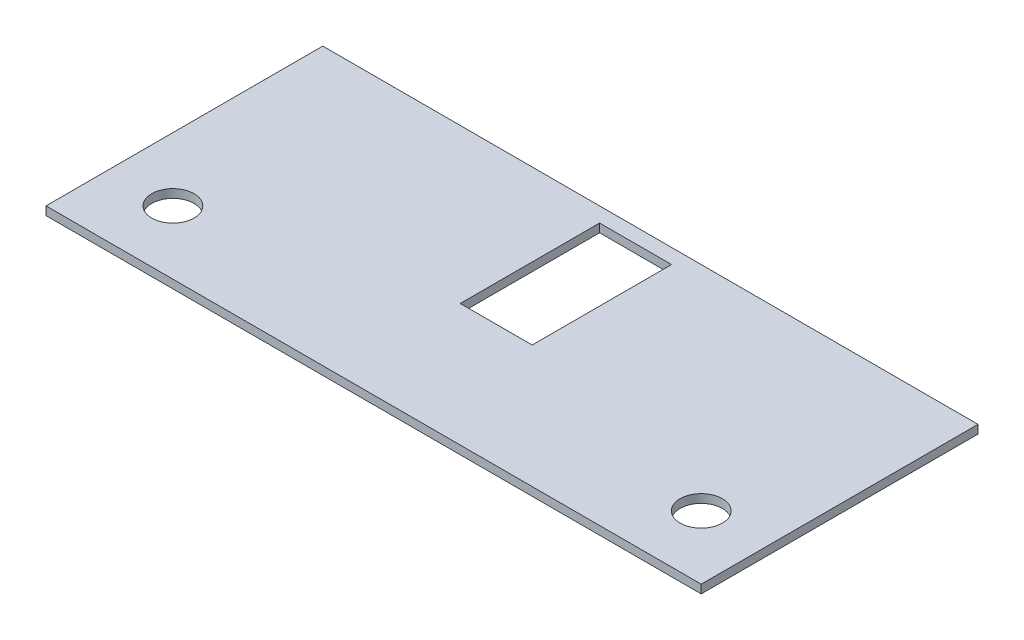
ISO-10303-21;
HEADER;
FILE_DESCRIPTION(('STEP AP214'),'2;1');
FILE_NAME('part.step','',(''),(''),'','','');
FILE_SCHEMA(('AUTOMOTIVE_DESIGN { 1 0 10303 214 1 1 1 1 }'));
ENDSEC;
DATA;
#1=APPLICATION_CONTEXT('core data for automotive mechanical design processes');
#2=APPLICATION_PROTOCOL_DEFINITION('international standard','automotive_design',2000,#1);
#3=PRODUCT_CONTEXT('',#1,'mechanical');
#4=PRODUCT('Part','Part','',(#3));
#5=PRODUCT_RELATED_PRODUCT_CATEGORY('part','',(#4));
#6=PRODUCT_DEFINITION_FORMATION('','',#4);
#7=PRODUCT_DEFINITION_CONTEXT('part definition',#1,'design');
#8=PRODUCT_DEFINITION('design','',#6,#7);
#9=PRODUCT_DEFINITION_SHAPE('','',#8);
#10=(LENGTH_UNIT() NAMED_UNIT(*) SI_UNIT(.MILLI.,.METRE.));
#11=(NAMED_UNIT(*) PLANE_ANGLE_UNIT() SI_UNIT($,.RADIAN.));
#12=(NAMED_UNIT(*) SI_UNIT($,.STERADIAN.) SOLID_ANGLE_UNIT());
#13=UNCERTAINTY_MEASURE_WITH_UNIT(LENGTH_MEASURE(1.E-05),#10,'distance_accuracy_value','');
#14=(GEOMETRIC_REPRESENTATION_CONTEXT(3) GLOBAL_UNCERTAINTY_ASSIGNED_CONTEXT((#13)) GLOBAL_UNIT_ASSIGNED_CONTEXT((#10,
#11,#12)) REPRESENTATION_CONTEXT('',''));
#15=CARTESIAN_POINT('',(0.,0.,0.));
#16=DIRECTION('',(0.,0.,1.));
#17=DIRECTION('',(1.,0.,0.));
#18=AXIS2_PLACEMENT_3D('',#15,#16,#17);
#19=CARTESIAN_POINT('',(77.4448618966642,2.,45.0351633886484));
#20=DIRECTION('',(0.,1.,0.));
#21=DIRECTION('',(0.,0.,1.));
#22=AXIS2_PLACEMENT_3D('',#19,#20,#21);
#23=PLANE('',#22);
#24=CARTESIAN_POINT('',(62.4448618966642,2.,30.0351633886483));
#25=DIRECTION('',(0.,1.,0.));
#26=DIRECTION('',(0.,0.,-1.));
#27=AXIS2_PLACEMENT_3D('',#24,#25,#26);
#28=CIRCLE('',#27,4.99999999999999);
#29=CARTESIAN_POINT('',(62.4448618966642,2.,25.0351633886483));
#30=VERTEX_POINT('',#29);
#31=EDGE_CURVE('E229',#30,#30,#28,.T.);
#32=ORIENTED_EDGE('',*,*,#31,.F.);
#33=EDGE_LOOP('',(#32));
#34=FACE_BOUND('',#33,.T.);
#35=CARTESIAN_POINT('',(-62.4448618966642,2.,30.0351633886484));
#36=DIRECTION('',(0.,1.,0.));
#37=DIRECTION('',(0.,0.,1.));
#38=AXIS2_PLACEMENT_3D('',#35,#36,#37);
#39=CIRCLE('',#38,5.);
#40=CARTESIAN_POINT('',(-62.4448618966642,2.,35.0351633886484));
#41=VERTEX_POINT('',#40);
#42=EDGE_CURVE('E231',#41,#41,#39,.T.);
#43=ORIENTED_EDGE('',*,*,#42,.F.);
#44=EDGE_LOOP('',(#43));
#45=FACE_BOUND('',#44,.T.);
#46=DIRECTION('',(0.,0.,-1.));
#47=VECTOR('',#46,1.);
#48=CARTESIAN_POINT('',(77.4448618966642,2.,-20.396112225157));
#49=LINE('',#48,#47);
#50=CARTESIAN_POINT('',(77.4448618966642,2.,45.0351633886484));
#51=VERTEX_POINT('',#50);
#52=CARTESIAN_POINT('',(77.4448618966642,2.,-20.396112225157));
#53=VERTEX_POINT('',#52);
#54=EDGE_CURVE('E135',#51,#53,#49,.T.);
#55=ORIENTED_EDGE('',*,*,#54,.T.);
#56=DIRECTION('',(-1.,0.,0.));
#57=VECTOR('',#56,1.);
#58=CARTESIAN_POINT('',(-77.4448618966642,2.,-20.396112225157));
#59=LINE('',#58,#57);
#60=CARTESIAN_POINT('',(-77.4448618966642,2.,-20.396112225157));
#61=VERTEX_POINT('',#60);
#62=EDGE_CURVE('E138',#53,#61,#59,.T.);
#63=ORIENTED_EDGE('',*,*,#62,.T.);
#64=DIRECTION('',(0.,0.,1.));
#65=VECTOR('',#64,1.);
#66=CARTESIAN_POINT('',(-77.4448618966642,2.,-20.396112225157));
#67=LINE('',#66,#65);
#68=CARTESIAN_POINT('',(-77.4448618966642,2.,45.0351633886484));
#69=VERTEX_POINT('',#68);
#70=EDGE_CURVE('E141',#61,#69,#67,.T.);
#71=ORIENTED_EDGE('',*,*,#70,.T.);
#72=DIRECTION('',(1.,0.,0.));
#73=VECTOR('',#72,1.);
#74=CARTESIAN_POINT('',(-77.4448618966642,2.,45.0351633886484));
#75=LINE('',#74,#73);
#76=EDGE_CURVE('E143',#69,#51,#75,.T.);
#77=ORIENTED_EDGE('',*,*,#76,.T.);
#78=EDGE_LOOP('',(#55,#63,#71,#77));
#79=FACE_BOUND('',#78,.T.);
#80=DIRECTION('',(-1.,0.,0.));
#81=VECTOR('',#80,1.);
#82=CARTESIAN_POINT('',(-8.49999999999999,2.,-16.8877392133737));
#83=LINE('',#82,#81);
#84=CARTESIAN_POINT('',(8.50000000000001,2.,-16.8877392133737));
#85=VERTEX_POINT('',#84);
#86=CARTESIAN_POINT('',(-8.49999999999999,2.,-16.8877392133737));
#87=VERTEX_POINT('',#86);
#88=EDGE_CURVE('E105',#85,#87,#83,.T.);
#89=ORIENTED_EDGE('',*,*,#88,.F.);
#90=DIRECTION('',(0.,0.,-1.));
#91=VECTOR('',#90,1.);
#92=CARTESIAN_POINT('',(8.50000000000001,2.,-16.8877392133737));
#93=LINE('',#92,#91);
#94=CARTESIAN_POINT('',(8.50000000000001,2.,16.0531848706699));
#95=VERTEX_POINT('',#94);
#96=EDGE_CURVE('E97',#95,#85,#93,.T.);
#97=ORIENTED_EDGE('',*,*,#96,.F.);
#98=DIRECTION('',(1.,0.,0.));
#99=VECTOR('',#98,1.);
#100=CARTESIAN_POINT('',(-8.49999999999999,2.,16.0531848706699));
#101=LINE('',#100,#99);
#102=CARTESIAN_POINT('',(-8.49999999999999,2.,16.0531848706699));
#103=VERTEX_POINT('',#102);
#104=EDGE_CURVE('E119',#103,#95,#101,.T.);
#105=ORIENTED_EDGE('',*,*,#104,.F.);
#106=DIRECTION('',(0.,0.,1.));
#107=VECTOR('',#106,1.);
#108=CARTESIAN_POINT('',(-8.49999999999999,2.,-16.8877392133737));
#109=LINE('',#108,#107);
#110=EDGE_CURVE('E117',#87,#103,#109,.T.);
#111=ORIENTED_EDGE('',*,*,#110,.F.);
#112=EDGE_LOOP('',(#89,#97,#105,#111));
#113=FACE_BOUND('',#112,.T.);
#114=ADVANCED_FACE('F32',(#34,#45,#79,#113),#23,.T.);
#115=CARTESIAN_POINT('',(77.4448618966642,0.,45.0351633886484));
#116=DIRECTION('',(0.,1.,0.));
#117=DIRECTION('',(0.,0.,1.));
#118=AXIS2_PLACEMENT_3D('',#115,#116,#117);
#119=PLANE('',#118);
#120=CARTESIAN_POINT('',(62.4448618966642,0.,30.0351633886483));
#121=DIRECTION('',(0.,1.,0.));
#122=DIRECTION('',(0.,0.,-1.));
#123=AXIS2_PLACEMENT_3D('',#120,#121,#122);
#124=CIRCLE('',#123,4.99999999999999);
#125=CARTESIAN_POINT('',(62.4448618966642,0.,25.0351633886483));
#126=VERTEX_POINT('',#125);
#127=EDGE_CURVE('E227',#126,#126,#124,.T.);
#128=ORIENTED_EDGE('',*,*,#127,.T.);
#129=EDGE_LOOP('',(#128));
#130=FACE_BOUND('',#129,.T.);
#131=CARTESIAN_POINT('',(-62.4448618966642,0.,30.0351633886484));
#132=DIRECTION('',(0.,1.,0.));
#133=DIRECTION('',(0.,0.,1.));
#134=AXIS2_PLACEMENT_3D('',#131,#132,#133);
#135=CIRCLE('',#134,5.);
#136=CARTESIAN_POINT('',(-62.4448618966642,0.,35.0351633886484));
#137=VERTEX_POINT('',#136);
#138=EDGE_CURVE('E125',#137,#137,#135,.T.);
#139=ORIENTED_EDGE('',*,*,#138,.T.);
#140=EDGE_LOOP('',(#139));
#141=FACE_BOUND('',#140,.T.);
#142=DIRECTION('',(0.,0.,-1.));
#143=VECTOR('',#142,1.);
#144=CARTESIAN_POINT('',(77.4448618966642,0.,-20.396112225157));
#145=LINE('',#144,#143);
#146=CARTESIAN_POINT('',(77.4448618966642,0.,45.0351633886484));
#147=VERTEX_POINT('',#146);
#148=CARTESIAN_POINT('',(77.4448618966642,0.,-20.396112225157));
#149=VERTEX_POINT('',#148);
#150=EDGE_CURVE('E113',#147,#149,#145,.T.);
#151=ORIENTED_EDGE('',*,*,#150,.F.);
#152=DIRECTION('',(1.,0.,0.));
#153=VECTOR('',#152,1.);
#154=CARTESIAN_POINT('',(-77.4448618966642,0.,45.0351633886484));
#155=LINE('',#154,#153);
#156=CARTESIAN_POINT('',(-77.4448618966642,0.,45.0351633886484));
#157=VERTEX_POINT('',#156);
#158=EDGE_CURVE('E139',#157,#147,#155,.T.);
#159=ORIENTED_EDGE('',*,*,#158,.F.);
#160=DIRECTION('',(0.,0.,1.));
#161=VECTOR('',#160,1.);
#162=CARTESIAN_POINT('',(-77.4448618966642,0.,-20.396112225157));
#163=LINE('',#162,#161);
#164=CARTESIAN_POINT('',(-77.4448618966642,0.,-20.396112225157));
#165=VERTEX_POINT('',#164);
#166=EDGE_CURVE('E150',#165,#157,#163,.T.);
#167=ORIENTED_EDGE('',*,*,#166,.F.);
#168=DIRECTION('',(-1.,0.,0.));
#169=VECTOR('',#168,1.);
#170=CARTESIAN_POINT('',(-77.4448618966642,0.,-20.396112225157));
#171=LINE('',#170,#169);
#172=EDGE_CURVE('E148',#149,#165,#171,.T.);
#173=ORIENTED_EDGE('',*,*,#172,.F.);
#174=EDGE_LOOP('',(#151,#159,#167,#173));
#175=FACE_BOUND('',#174,.T.);
#176=DIRECTION('',(0.,0.,-1.));
#177=VECTOR('',#176,1.);
#178=CARTESIAN_POINT('',(8.50000000000001,0.,-16.8877392133737));
#179=LINE('',#178,#177);
#180=CARTESIAN_POINT('',(8.50000000000001,0.,16.0531848706699));
#181=VERTEX_POINT('',#180);
#182=CARTESIAN_POINT('',(8.50000000000001,0.,-16.8877392133737));
#183=VERTEX_POINT('',#182);
#184=EDGE_CURVE('E55',#181,#183,#179,.T.);
#185=ORIENTED_EDGE('',*,*,#184,.T.);
#186=DIRECTION('',(-1.,0.,0.));
#187=VECTOR('',#186,1.);
#188=CARTESIAN_POINT('',(-8.49999999999999,0.,-16.8877392133737));
#189=LINE('',#188,#187);
#190=CARTESIAN_POINT('',(-8.49999999999999,0.,-16.8877392133737));
#191=VERTEX_POINT('',#190);
#192=EDGE_CURVE('E112',#183,#191,#189,.T.);
#193=ORIENTED_EDGE('',*,*,#192,.T.);
#194=DIRECTION('',(0.,0.,1.));
#195=VECTOR('',#194,1.);
#196=CARTESIAN_POINT('',(-8.49999999999999,0.,-16.8877392133737));
#197=LINE('',#196,#195);
#198=CARTESIAN_POINT('',(-8.49999999999999,0.,16.0531848706699));
#199=VERTEX_POINT('',#198);
#200=EDGE_CURVE('E127',#191,#199,#197,.T.);
#201=ORIENTED_EDGE('',*,*,#200,.T.);
#202=DIRECTION('',(1.,0.,0.));
#203=VECTOR('',#202,1.);
#204=CARTESIAN_POINT('',(-8.49999999999999,0.,16.0531848706699));
#205=LINE('',#204,#203);
#206=EDGE_CURVE('E106',#199,#181,#205,.T.);
#207=ORIENTED_EDGE('',*,*,#206,.T.);
#208=EDGE_LOOP('',(#185,#193,#201,#207));
#209=FACE_BOUND('',#208,.T.);
#210=ADVANCED_FACE('F168',(#130,#141,#175,#209),#119,.F.);
#211=CARTESIAN_POINT('',(77.4448618966642,2.,-20.396112225157));
#212=DIRECTION('',(-1.,0.,0.));
#213=DIRECTION('',(0.,0.,1.));
#214=AXIS2_PLACEMENT_3D('',#211,#212,#213);
#215=PLANE('',#214);
#216=ORIENTED_EDGE('',*,*,#150,.T.);
#217=DIRECTION('',(0.,-1.,0.));
#218=VECTOR('',#217,1.);
#219=CARTESIAN_POINT('',(77.4448618966642,2.,-20.396112225157));
#220=LINE('',#219,#218);
#221=EDGE_CURVE('E11',#53,#149,#220,.T.);
#222=ORIENTED_EDGE('',*,*,#221,.F.);
#223=ORIENTED_EDGE('',*,*,#54,.F.);
#224=DIRECTION('',(0.,-1.,0.));
#225=VECTOR('',#224,1.);
#226=CARTESIAN_POINT('',(77.4448618966642,2.,45.0351633886484));
#227=LINE('',#226,#225);
#228=EDGE_CURVE('E145',#51,#147,#227,.T.);
#229=ORIENTED_EDGE('',*,*,#228,.T.);
#230=EDGE_LOOP('',(#216,#222,#223,#229));
#231=FACE_BOUND('',#230,.T.);
#232=ADVANCED_FACE('F34',(#231),#215,.F.);
#233=CARTESIAN_POINT('',(-77.4448618966642,2.,-20.396112225157));
#234=DIRECTION('',(0.,0.,1.));
#235=DIRECTION('',(1.,0.,0.));
#236=AXIS2_PLACEMENT_3D('',#233,#234,#235);
#237=PLANE('',#236);
#238=ORIENTED_EDGE('',*,*,#172,.T.);
#239=DIRECTION('',(0.,-1.,0.));
#240=VECTOR('',#239,1.);
#241=CARTESIAN_POINT('',(-77.4448618966642,2.,-20.396112225157));
#242=LINE('',#241,#240);
#243=EDGE_CURVE('E40',#61,#165,#242,.T.);
#244=ORIENTED_EDGE('',*,*,#243,.F.);
#245=ORIENTED_EDGE('',*,*,#62,.F.);
#246=ORIENTED_EDGE('',*,*,#221,.T.);
#247=EDGE_LOOP('',(#238,#244,#245,#246));
#248=FACE_BOUND('',#247,.T.);
#249=ADVANCED_FACE('F178',(#248),#237,.F.);
#250=CARTESIAN_POINT('',(-77.4448618966642,2.,-20.396112225157));
#251=DIRECTION('',(1.,0.,0.));
#252=DIRECTION('',(0.,0.,-1.));
#253=AXIS2_PLACEMENT_3D('',#250,#251,#252);
#254=PLANE('',#253);
#255=ORIENTED_EDGE('',*,*,#166,.T.);
#256=DIRECTION('',(0.,-1.,0.));
#257=VECTOR('',#256,1.);
#258=CARTESIAN_POINT('',(-77.4448618966642,2.,45.0351633886484));
#259=LINE('',#258,#257);
#260=EDGE_CURVE('E155',#69,#157,#259,.T.);
#261=ORIENTED_EDGE('',*,*,#260,.F.);
#262=ORIENTED_EDGE('',*,*,#70,.F.);
#263=ORIENTED_EDGE('',*,*,#243,.T.);
#264=EDGE_LOOP('',(#255,#261,#262,#263));
#265=FACE_BOUND('',#264,.T.);
#266=ADVANCED_FACE('F162',(#265),#254,.F.);
#267=CARTESIAN_POINT('',(-77.4448618966642,2.,45.0351633886484));
#268=DIRECTION('',(0.,0.,-1.));
#269=DIRECTION('',(-1.,0.,0.));
#270=AXIS2_PLACEMENT_3D('',#267,#268,#269);
#271=PLANE('',#270);
#272=ORIENTED_EDGE('',*,*,#158,.T.);
#273=ORIENTED_EDGE('',*,*,#228,.F.);
#274=ORIENTED_EDGE('',*,*,#76,.F.);
#275=ORIENTED_EDGE('',*,*,#260,.T.);
#276=EDGE_LOOP('',(#272,#273,#274,#275));
#277=FACE_BOUND('',#276,.T.);
#278=ADVANCED_FACE('F172',(#277),#271,.F.);
#279=CARTESIAN_POINT('',(8.50000000000001,2.,-16.8877392133737));
#280=DIRECTION('',(-1.,0.,0.));
#281=DIRECTION('',(0.,0.,1.));
#282=AXIS2_PLACEMENT_3D('',#279,#280,#281);
#283=PLANE('',#282);
#284=ORIENTED_EDGE('',*,*,#184,.F.);
#285=DIRECTION('',(0.,-1.,0.));
#286=VECTOR('',#285,1.);
#287=CARTESIAN_POINT('',(8.50000000000001,2.,16.0531848706699));
#288=LINE('',#287,#286);
#289=EDGE_CURVE('E101',#95,#181,#288,.T.);
#290=ORIENTED_EDGE('',*,*,#289,.F.);
#291=ORIENTED_EDGE('',*,*,#96,.T.);
#292=DIRECTION('',(0.,-1.,0.));
#293=VECTOR('',#292,1.);
#294=CARTESIAN_POINT('',(8.50000000000001,2.,-16.8877392133737));
#295=LINE('',#294,#293);
#296=EDGE_CURVE('E100',#85,#183,#295,.T.);
#297=ORIENTED_EDGE('',*,*,#296,.T.);
#298=EDGE_LOOP('',(#284,#290,#291,#297));
#299=FACE_BOUND('',#298,.T.);
#300=ADVANCED_FACE('F99',(#299),#283,.T.);
#301=CARTESIAN_POINT('',(-8.49999999999999,2.,-16.8877392133737));
#302=DIRECTION('',(0.,0.,1.));
#303=DIRECTION('',(1.,0.,0.));
#304=AXIS2_PLACEMENT_3D('',#301,#302,#303);
#305=PLANE('',#304);
#306=ORIENTED_EDGE('',*,*,#192,.F.);
#307=ORIENTED_EDGE('',*,*,#296,.F.);
#308=ORIENTED_EDGE('',*,*,#88,.T.);
#309=DIRECTION('',(0.,-1.,0.));
#310=VECTOR('',#309,1.);
#311=CARTESIAN_POINT('',(-8.49999999999999,2.,-16.8877392133737));
#312=LINE('',#311,#310);
#313=EDGE_CURVE('E114',#87,#191,#312,.T.);
#314=ORIENTED_EDGE('',*,*,#313,.T.);
#315=EDGE_LOOP('',(#306,#307,#308,#314));
#316=FACE_BOUND('',#315,.T.);
#317=ADVANCED_FACE('F109',(#316),#305,.T.);
#318=CARTESIAN_POINT('',(-8.49999999999999,2.,-16.8877392133737));
#319=DIRECTION('',(1.,0.,0.));
#320=DIRECTION('',(0.,0.,-1.));
#321=AXIS2_PLACEMENT_3D('',#318,#319,#320);
#322=PLANE('',#321);
#323=ORIENTED_EDGE('',*,*,#200,.F.);
#324=ORIENTED_EDGE('',*,*,#313,.F.);
#325=ORIENTED_EDGE('',*,*,#110,.T.);
#326=DIRECTION('',(0.,-1.,0.));
#327=VECTOR('',#326,1.);
#328=CARTESIAN_POINT('',(-8.49999999999999,2.,16.0531848706699));
#329=LINE('',#328,#327);
#330=EDGE_CURVE('E47',#103,#199,#329,.T.);
#331=ORIENTED_EDGE('',*,*,#330,.T.);
#332=EDGE_LOOP('',(#323,#324,#325,#331));
#333=FACE_BOUND('',#332,.T.);
#334=ADVANCED_FACE('F205',(#333),#322,.T.);
#335=CARTESIAN_POINT('',(-8.49999999999999,2.,16.0531848706699));
#336=DIRECTION('',(0.,0.,-1.));
#337=DIRECTION('',(-1.,0.,0.));
#338=AXIS2_PLACEMENT_3D('',#335,#336,#337);
#339=PLANE('',#338);
#340=ORIENTED_EDGE('',*,*,#206,.F.);
#341=ORIENTED_EDGE('',*,*,#330,.F.);
#342=ORIENTED_EDGE('',*,*,#104,.T.);
#343=ORIENTED_EDGE('',*,*,#289,.T.);
#344=EDGE_LOOP('',(#340,#341,#342,#343));
#345=FACE_BOUND('',#344,.T.);
#346=ADVANCED_FACE('F209',(#345),#339,.T.);
#347=CARTESIAN_POINT('',(-62.4448618966642,0.,30.0351633886484));
#348=DIRECTION('',(0.,1.,0.));
#349=DIRECTION('',(0.,0.,1.));
#350=AXIS2_PLACEMENT_3D('',#347,#348,#349);
#351=CYLINDRICAL_SURFACE('',#350,5.);
#352=ORIENTED_EDGE('',*,*,#138,.F.);
#353=EDGE_LOOP('',(#352));
#354=FACE_BOUND('',#353,.T.);
#355=ORIENTED_EDGE('',*,*,#42,.T.);
#356=EDGE_LOOP('',(#355));
#357=FACE_BOUND('',#356,.T.);
#358=ADVANCED_FACE('F215',(#354,#357),#351,.F.);
#359=CARTESIAN_POINT('',(62.4448618966642,0.,30.0351633886483));
#360=DIRECTION('',(0.,1.,0.));
#361=DIRECTION('',(0.,0.,1.));
#362=AXIS2_PLACEMENT_3D('',#359,#360,#361);
#363=CYLINDRICAL_SURFACE('',#362,4.99999999999999);
#364=ORIENTED_EDGE('',*,*,#127,.F.);
#365=EDGE_LOOP('',(#364));
#366=FACE_BOUND('',#365,.T.);
#367=ORIENTED_EDGE('',*,*,#31,.T.);
#368=EDGE_LOOP('',(#367));
#369=FACE_BOUND('',#368,.T.);
#370=ADVANCED_FACE('F218',(#366,#369),#363,.F.);
#371=CLOSED_SHELL('',(#114,#210,#232,#249,#266,#278,#300,#317,#334,#346,#358,#370));
#372=MANIFOLD_SOLID_BREP('B2',#371);
#373=ADVANCED_BREP_SHAPE_REPRESENTATION('',(#18,#372),#14);
#374=SHAPE_DEFINITION_REPRESENTATION(#9,#373);
ENDSEC;
END-ISO-10303-21;
